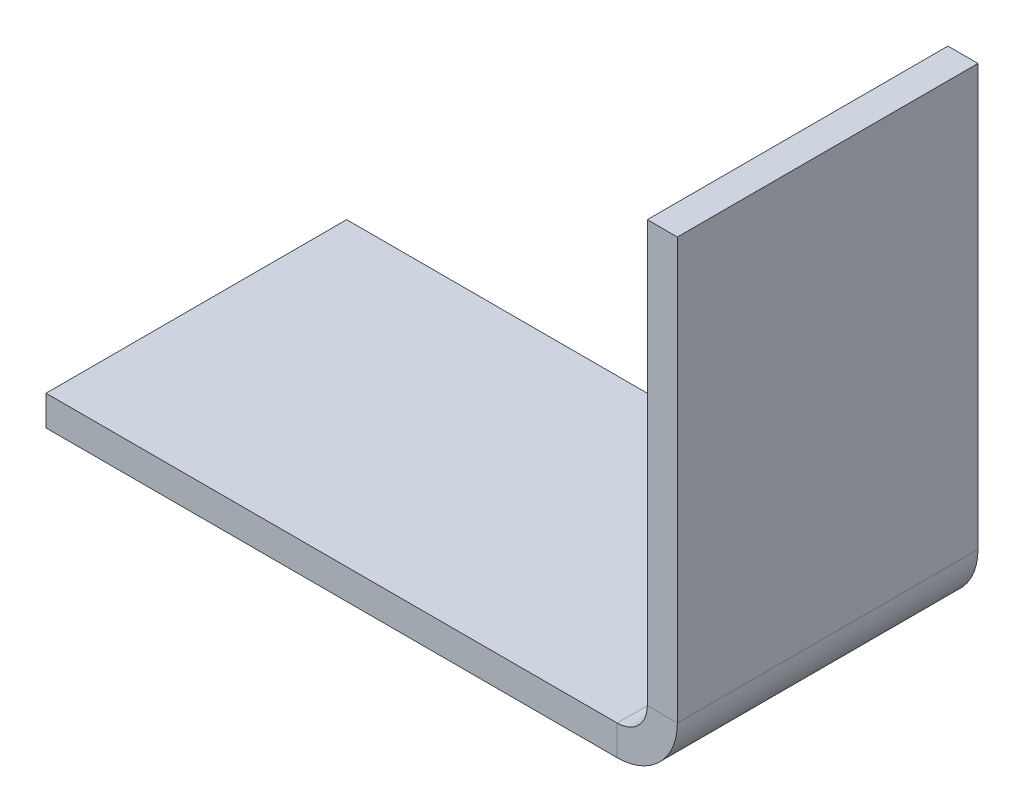
ISO-10303-21;
HEADER;
FILE_DESCRIPTION(('STEP AP214'),'2;1');
FILE_NAME('part.step','',(''),(''),'','','');
FILE_SCHEMA(('AUTOMOTIVE_DESIGN { 1 0 10303 214 1 1 1 1 }'));
ENDSEC;
DATA;
#1=APPLICATION_CONTEXT('core data for automotive mechanical design processes');
#2=APPLICATION_PROTOCOL_DEFINITION('international standard','automotive_design',2000,#1);
#3=PRODUCT_CONTEXT('',#1,'mechanical');
#4=PRODUCT('Part','Part','',(#3));
#5=PRODUCT_RELATED_PRODUCT_CATEGORY('part','',(#4));
#6=PRODUCT_DEFINITION_FORMATION('','',#4);
#7=PRODUCT_DEFINITION_CONTEXT('part definition',#1,'design');
#8=PRODUCT_DEFINITION('design','',#6,#7);
#9=PRODUCT_DEFINITION_SHAPE('','',#8);
#10=(LENGTH_UNIT() NAMED_UNIT(*) SI_UNIT(.MILLI.,.METRE.));
#11=(NAMED_UNIT(*) PLANE_ANGLE_UNIT() SI_UNIT($,.RADIAN.));
#12=(NAMED_UNIT(*) SI_UNIT($,.STERADIAN.) SOLID_ANGLE_UNIT());
#13=UNCERTAINTY_MEASURE_WITH_UNIT(LENGTH_MEASURE(1.E-05),#10,'distance_accuracy_value','');
#14=(GEOMETRIC_REPRESENTATION_CONTEXT(3) GLOBAL_UNCERTAINTY_ASSIGNED_CONTEXT((#13)) GLOBAL_UNIT_ASSIGNED_CONTEXT((#10,
#11,#12)) REPRESENTATION_CONTEXT('',''));
#15=CARTESIAN_POINT('',(0.,0.,0.));
#16=DIRECTION('',(0.,0.,1.));
#17=DIRECTION('',(1.,0.,0.));
#18=AXIS2_PLACEMENT_3D('',#15,#16,#17);
#19=CARTESIAN_POINT('',(20.,1.,10.));
#20=DIRECTION('',(0.,0.,1.));
#21=DIRECTION('',(1.,0.,0.));
#22=AXIS2_PLACEMENT_3D('',#19,#20,#21);
#23=PLANE('',#22);
#24=DIRECTION('',(1.,0.,0.));
#25=VECTOR('',#24,1.);
#26=CARTESIAN_POINT('',(20.,1.,10.));
#27=LINE('',#26,#25);
#28=CARTESIAN_POINT('',(20.,1.,10.));
#29=VERTEX_POINT('',#28);
#30=CARTESIAN_POINT('',(21.,1.,10.));
#31=VERTEX_POINT('',#30);
#32=EDGE_CURVE('E11',#29,#31,#27,.T.);
#33=ORIENTED_EDGE('',*,*,#32,.F.);
#34=CARTESIAN_POINT('',(19.,1.,10.));
#35=DIRECTION('',(0.,0.,-1.));
#36=DIRECTION('',(-1.,0.,0.));
#37=AXIS2_PLACEMENT_3D('',#34,#35,#36);
#38=CIRCLE('',#37,1.);
#39=CARTESIAN_POINT('',(19.,0.,10.));
#40=VERTEX_POINT('',#39);
#41=EDGE_CURVE('E136',#40,#29,#38,.F.);
#42=ORIENTED_EDGE('',*,*,#41,.F.);
#43=DIRECTION('',(0.,1.,0.));
#44=VECTOR('',#43,1.);
#45=CARTESIAN_POINT('',(19.,-1.,10.));
#46=LINE('',#45,#44);
#47=CARTESIAN_POINT('',(19.,-1.,10.));
#48=VERTEX_POINT('',#47);
#49=EDGE_CURVE('E47',#48,#40,#46,.T.);
#50=ORIENTED_EDGE('',*,*,#49,.F.);
#51=CARTESIAN_POINT('',(19.,1.,10.));
#52=DIRECTION('',(0.,0.,1.));
#53=DIRECTION('',(1.,0.,0.));
#54=AXIS2_PLACEMENT_3D('',#51,#52,#53);
#55=CIRCLE('',#54,2.);
#56=EDGE_CURVE('E133',#48,#31,#55,.T.);
#57=ORIENTED_EDGE('',*,*,#56,.T.);
#58=EDGE_LOOP('',(#33,#42,#50,#57));
#59=FACE_BOUND('',#58,.T.);
#60=ADVANCED_FACE('F41',(#59),#23,.T.);
#61=CARTESIAN_POINT('',(19.,-1.,10.));
#62=DIRECTION('',(0.,0.,1.));
#63=DIRECTION('',(1.,0.,0.));
#64=AXIS2_PLACEMENT_3D('',#61,#62,#63);
#65=PLANE('',#64);
#66=DIRECTION('',(0.,1.,0.));
#67=VECTOR('',#66,1.);
#68=CARTESIAN_POINT('',(20.,0.,10.));
#69=LINE('',#68,#67);
#70=CARTESIAN_POINT('',(20.,15.,10.));
#71=VERTEX_POINT('',#70);
#72=EDGE_CURVE('E189',#29,#71,#69,.T.);
#73=ORIENTED_EDGE('',*,*,#72,.F.);
#74=ORIENTED_EDGE('',*,*,#32,.T.);
#75=DIRECTION('',(0.,1.,0.));
#76=VECTOR('',#75,1.);
#77=CARTESIAN_POINT('',(21.,0.,10.));
#78=LINE('',#77,#76);
#79=CARTESIAN_POINT('',(21.,15.,10.));
#80=VERTEX_POINT('',#79);
#81=EDGE_CURVE('E100',#31,#80,#78,.T.);
#82=ORIENTED_EDGE('',*,*,#81,.T.);
#83=DIRECTION('',(1.,0.,0.));
#84=VECTOR('',#83,1.);
#85=CARTESIAN_POINT('',(20.,15.,10.));
#86=LINE('',#85,#84);
#87=EDGE_CURVE('E344',#71,#80,#86,.T.);
#88=ORIENTED_EDGE('',*,*,#87,.F.);
#89=EDGE_LOOP('',(#73,#74,#82,#88));
#90=FACE_BOUND('',#89,.T.);
#91=ADVANCED_FACE('F192',(#90),#65,.T.);
#92=CARTESIAN_POINT('',(19.,0.,0.));
#93=DIRECTION('',(0.,0.,-1.));
#94=DIRECTION('',(-1.,0.,0.));
#95=AXIS2_PLACEMENT_3D('',#92,#93,#94);
#96=PLANE('',#95);
#97=DIRECTION('',(0.,-1.,0.));
#98=VECTOR('',#97,1.);
#99=CARTESIAN_POINT('',(19.,0.,0.));
#100=LINE('',#99,#98);
#101=CARTESIAN_POINT('',(19.,0.,0.));
#102=VERTEX_POINT('',#101);
#103=CARTESIAN_POINT('',(19.,-1.,0.));
#104=VERTEX_POINT('',#103);
#105=EDGE_CURVE('E84',#102,#104,#100,.T.);
#106=ORIENTED_EDGE('',*,*,#105,.F.);
#107=CARTESIAN_POINT('',(19.,1.,0.));
#108=DIRECTION('',(0.,0.,-1.));
#109=DIRECTION('',(-1.,0.,0.));
#110=AXIS2_PLACEMENT_3D('',#107,#108,#109);
#111=CIRCLE('',#110,1.);
#112=CARTESIAN_POINT('',(20.,1.,0.));
#113=VERTEX_POINT('',#112);
#114=EDGE_CURVE('E153',#102,#113,#111,.F.);
#115=ORIENTED_EDGE('',*,*,#114,.T.);
#116=DIRECTION('',(-1.,0.,0.));
#117=VECTOR('',#116,1.);
#118=CARTESIAN_POINT('',(21.,1.,0.));
#119=LINE('',#118,#117);
#120=CARTESIAN_POINT('',(21.,1.,0.));
#121=VERTEX_POINT('',#120);
#122=EDGE_CURVE('E93',#121,#113,#119,.T.);
#123=ORIENTED_EDGE('',*,*,#122,.F.);
#124=CARTESIAN_POINT('',(19.,1.,0.));
#125=DIRECTION('',(0.,0.,1.));
#126=DIRECTION('',(1.,0.,0.));
#127=AXIS2_PLACEMENT_3D('',#124,#125,#126);
#128=CIRCLE('',#127,2.);
#129=EDGE_CURVE('E159',#104,#121,#128,.T.);
#130=ORIENTED_EDGE('',*,*,#129,.F.);
#131=EDGE_LOOP('',(#106,#115,#123,#130));
#132=FACE_BOUND('',#131,.T.);
#133=ADVANCED_FACE('F191',(#132),#96,.T.);
#134=CARTESIAN_POINT('',(21.,1.,0.));
#135=DIRECTION('',(0.,0.,-1.));
#136=DIRECTION('',(-1.,0.,0.));
#137=AXIS2_PLACEMENT_3D('',#134,#135,#136);
#138=PLANE('',#137);
#139=DIRECTION('',(1.,0.,0.));
#140=VECTOR('',#139,1.);
#141=CARTESIAN_POINT('',(0.,0.,0.));
#142=LINE('',#141,#140);
#143=CARTESIAN_POINT('',(0.,0.,0.));
#144=VERTEX_POINT('',#143);
#145=EDGE_CURVE('E154',#144,#102,#142,.T.);
#146=ORIENTED_EDGE('',*,*,#145,.T.);
#147=ORIENTED_EDGE('',*,*,#105,.T.);
#148=DIRECTION('',(1.,0.,0.));
#149=VECTOR('',#148,1.);
#150=CARTESIAN_POINT('',(0.,-1.,0.));
#151=LINE('',#150,#149);
#152=CARTESIAN_POINT('',(0.,-1.,0.));
#153=VERTEX_POINT('',#152);
#154=EDGE_CURVE('E158',#153,#104,#151,.T.);
#155=ORIENTED_EDGE('',*,*,#154,.F.);
#156=DIRECTION('',(0.,1.,0.));
#157=VECTOR('',#156,1.);
#158=CARTESIAN_POINT('',(0.,-1.,0.));
#159=LINE('',#158,#157);
#160=EDGE_CURVE('E120',#153,#144,#159,.T.);
#161=ORIENTED_EDGE('',*,*,#160,.T.);
#162=EDGE_LOOP('',(#146,#147,#155,#161));
#163=FACE_BOUND('',#162,.T.);
#164=ADVANCED_FACE('F190',(#163),#138,.T.);
#165=CARTESIAN_POINT('',(21.,0.,10.));
#166=DIRECTION('',(-1.,0.,0.));
#167=DIRECTION('',(0.,0.,1.));
#168=AXIS2_PLACEMENT_3D('',#165,#166,#167);
#169=PLANE('',#168);
#170=DIRECTION('',(0.,1.,0.));
#171=VECTOR('',#170,1.);
#172=CARTESIAN_POINT('',(21.,0.,0.));
#173=LINE('',#172,#171);
#174=CARTESIAN_POINT('',(21.,15.,0.));
#175=VERTEX_POINT('',#174);
#176=EDGE_CURVE('E145',#121,#175,#173,.T.);
#177=ORIENTED_EDGE('',*,*,#176,.T.);
#178=DIRECTION('',(0.,0.,-1.));
#179=VECTOR('',#178,1.);
#180=CARTESIAN_POINT('',(21.,15.,10.));
#181=LINE('',#180,#179);
#182=EDGE_CURVE('E175',#80,#175,#181,.T.);
#183=ORIENTED_EDGE('',*,*,#182,.F.);
#184=ORIENTED_EDGE('',*,*,#81,.F.);
#185=DIRECTION('',(0.,0.,-1.));
#186=VECTOR('',#185,1.);
#187=CARTESIAN_POINT('',(21.,1.,10.));
#188=LINE('',#187,#186);
#189=EDGE_CURVE('E141',#31,#121,#188,.T.);
#190=ORIENTED_EDGE('',*,*,#189,.T.);
#191=EDGE_LOOP('',(#177,#183,#184,#190));
#192=FACE_BOUND('',#191,.T.);
#193=ADVANCED_FACE('F203',(#192),#169,.F.);
#194=CARTESIAN_POINT('',(20.,15.,10.));
#195=DIRECTION('',(0.,1.,0.));
#196=DIRECTION('',(0.,0.,1.));
#197=AXIS2_PLACEMENT_3D('',#194,#195,#196);
#198=PLANE('',#197);
#199=DIRECTION('',(1.,0.,0.));
#200=VECTOR('',#199,1.);
#201=CARTESIAN_POINT('',(20.,15.,0.));
#202=LINE('',#201,#200);
#203=CARTESIAN_POINT('',(20.,15.,0.));
#204=VERTEX_POINT('',#203);
#205=EDGE_CURVE('E150',#204,#175,#202,.T.);
#206=ORIENTED_EDGE('',*,*,#205,.F.);
#207=DIRECTION('',(0.,0.,-1.));
#208=VECTOR('',#207,1.);
#209=CARTESIAN_POINT('',(20.,15.,10.));
#210=LINE('',#209,#208);
#211=EDGE_CURVE('E174',#71,#204,#210,.T.);
#212=ORIENTED_EDGE('',*,*,#211,.F.);
#213=ORIENTED_EDGE('',*,*,#87,.T.);
#214=ORIENTED_EDGE('',*,*,#182,.T.);
#215=EDGE_LOOP('',(#206,#212,#213,#214));
#216=FACE_BOUND('',#215,.T.);
#217=ADVANCED_FACE('F234',(#216),#198,.T.);
#218=CARTESIAN_POINT('',(20.,0.,10.));
#219=DIRECTION('',(-1.,0.,0.));
#220=DIRECTION('',(0.,0.,1.));
#221=AXIS2_PLACEMENT_3D('',#218,#219,#220);
#222=PLANE('',#221);
#223=DIRECTION('',(0.,1.,0.));
#224=VECTOR('',#223,1.);
#225=CARTESIAN_POINT('',(20.,0.,0.));
#226=LINE('',#225,#224);
#227=EDGE_CURVE('E147',#113,#204,#226,.T.);
#228=ORIENTED_EDGE('',*,*,#227,.F.);
#229=DIRECTION('',(0.,0.,-1.));
#230=VECTOR('',#229,1.);
#231=CARTESIAN_POINT('',(20.,1.,10.));
#232=LINE('',#231,#230);
#233=EDGE_CURVE('E166',#29,#113,#232,.T.);
#234=ORIENTED_EDGE('',*,*,#233,.F.);
#235=ORIENTED_EDGE('',*,*,#72,.T.);
#236=ORIENTED_EDGE('',*,*,#211,.T.);
#237=EDGE_LOOP('',(#228,#234,#235,#236));
#238=FACE_BOUND('',#237,.T.);
#239=ADVANCED_FACE('F241',(#238),#222,.T.);
#240=CARTESIAN_POINT('',(19.,1.,10.));
#241=DIRECTION('',(0.,0.,-1.));
#242=DIRECTION('',(-1.,0.,0.));
#243=AXIS2_PLACEMENT_3D('',#240,#241,#242);
#244=CYLINDRICAL_SURFACE('',#243,1.);
#245=ORIENTED_EDGE('',*,*,#114,.F.);
#246=DIRECTION('',(0.,0.,-1.));
#247=VECTOR('',#246,1.);
#248=CARTESIAN_POINT('',(19.,0.,10.));
#249=LINE('',#248,#247);
#250=EDGE_CURVE('E167',#40,#102,#249,.T.);
#251=ORIENTED_EDGE('',*,*,#250,.F.);
#252=ORIENTED_EDGE('',*,*,#41,.T.);
#253=ORIENTED_EDGE('',*,*,#233,.T.);
#254=EDGE_LOOP('',(#245,#251,#252,#253));
#255=FACE_BOUND('',#254,.T.);
#256=ADVANCED_FACE('F181',(#255),#244,.F.);
#257=CARTESIAN_POINT('',(0.,0.,10.));
#258=DIRECTION('',(0.,1.,0.));
#259=DIRECTION('',(0.,0.,1.));
#260=AXIS2_PLACEMENT_3D('',#257,#258,#259);
#261=PLANE('',#260);
#262=ORIENTED_EDGE('',*,*,#145,.F.);
#263=DIRECTION('',(0.,0.,-1.));
#264=VECTOR('',#263,1.);
#265=CARTESIAN_POINT('',(0.,0.,10.));
#266=LINE('',#265,#264);
#267=CARTESIAN_POINT('',(0.,0.,10.));
#268=VERTEX_POINT('',#267);
#269=EDGE_CURVE('E123',#268,#144,#266,.T.);
#270=ORIENTED_EDGE('',*,*,#269,.F.);
#271=DIRECTION('',(1.,0.,0.));
#272=VECTOR('',#271,1.);
#273=CARTESIAN_POINT('',(0.,0.,10.));
#274=LINE('',#273,#272);
#275=EDGE_CURVE('E138',#268,#40,#274,.T.);
#276=ORIENTED_EDGE('',*,*,#275,.T.);
#277=ORIENTED_EDGE('',*,*,#250,.T.);
#278=EDGE_LOOP('',(#262,#270,#276,#277));
#279=FACE_BOUND('',#278,.T.);
#280=ADVANCED_FACE('F187',(#279),#261,.T.);
#281=CARTESIAN_POINT('',(0.,-1.,10.));
#282=DIRECTION('',(-1.,0.,0.));
#283=DIRECTION('',(0.,0.,1.));
#284=AXIS2_PLACEMENT_3D('',#281,#282,#283);
#285=PLANE('',#284);
#286=ORIENTED_EDGE('',*,*,#160,.F.);
#287=DIRECTION('',(0.,0.,-1.));
#288=VECTOR('',#287,1.);
#289=CARTESIAN_POINT('',(0.,-1.,10.));
#290=LINE('',#289,#288);
#291=CARTESIAN_POINT('',(0.,-1.,10.));
#292=VERTEX_POINT('',#291);
#293=EDGE_CURVE('E114',#292,#153,#290,.T.);
#294=ORIENTED_EDGE('',*,*,#293,.F.);
#295=DIRECTION('',(0.,1.,0.));
#296=VECTOR('',#295,1.);
#297=CARTESIAN_POINT('',(0.,-1.,10.));
#298=LINE('',#297,#296);
#299=EDGE_CURVE('E119',#292,#268,#298,.T.);
#300=ORIENTED_EDGE('',*,*,#299,.T.);
#301=ORIENTED_EDGE('',*,*,#269,.T.);
#302=EDGE_LOOP('',(#286,#294,#300,#301));
#303=FACE_BOUND('',#302,.T.);
#304=ADVANCED_FACE('F113',(#303),#285,.T.);
#305=CARTESIAN_POINT('',(0.,-1.,10.));
#306=DIRECTION('',(0.,1.,0.));
#307=DIRECTION('',(0.,0.,1.));
#308=AXIS2_PLACEMENT_3D('',#305,#306,#307);
#309=PLANE('',#308);
#310=ORIENTED_EDGE('',*,*,#154,.T.);
#311=DIRECTION('',(0.,0.,-1.));
#312=VECTOR('',#311,1.);
#313=CARTESIAN_POINT('',(19.,-1.,10.));
#314=LINE('',#313,#312);
#315=EDGE_CURVE('E125',#48,#104,#314,.T.);
#316=ORIENTED_EDGE('',*,*,#315,.F.);
#317=DIRECTION('',(1.,0.,0.));
#318=VECTOR('',#317,1.);
#319=CARTESIAN_POINT('',(0.,-1.,10.));
#320=LINE('',#319,#318);
#321=EDGE_CURVE('E127',#292,#48,#320,.T.);
#322=ORIENTED_EDGE('',*,*,#321,.F.);
#323=ORIENTED_EDGE('',*,*,#293,.T.);
#324=EDGE_LOOP('',(#310,#316,#322,#323));
#325=FACE_BOUND('',#324,.T.);
#326=ADVANCED_FACE('F130',(#325),#309,.F.);
#327=CARTESIAN_POINT('',(19.,1.,10.));
#328=DIRECTION('',(0.,0.,-1.));
#329=DIRECTION('',(-1.,0.,0.));
#330=AXIS2_PLACEMENT_3D('',#327,#328,#329);
#331=CYLINDRICAL_SURFACE('',#330,2.);
#332=ORIENTED_EDGE('',*,*,#129,.T.);
#333=ORIENTED_EDGE('',*,*,#189,.F.);
#334=ORIENTED_EDGE('',*,*,#56,.F.);
#335=ORIENTED_EDGE('',*,*,#315,.T.);
#336=EDGE_LOOP('',(#332,#333,#334,#335));
#337=FACE_BOUND('',#336,.T.);
#338=ADVANCED_FACE('F193',(#337),#331,.T.);
#339=CARTESIAN_POINT('',(19.,1.,10.));
#340=DIRECTION('',(0.,0.,-1.));
#341=DIRECTION('',(-1.,0.,0.));
#342=AXIS2_PLACEMENT_3D('',#339,#340,#341);
#343=PLANE('',#342);
#344=ORIENTED_EDGE('',*,*,#321,.T.);
#345=ORIENTED_EDGE('',*,*,#49,.T.);
#346=ORIENTED_EDGE('',*,*,#275,.F.);
#347=ORIENTED_EDGE('',*,*,#299,.F.);
#348=EDGE_LOOP('',(#344,#345,#346,#347));
#349=FACE_BOUND('',#348,.T.);
#350=ADVANCED_FACE('F135',(#349),#343,.F.);
#351=CARTESIAN_POINT('',(19.,1.,0.));
#352=DIRECTION('',(0.,0.,-1.));
#353=DIRECTION('',(-1.,0.,0.));
#354=AXIS2_PLACEMENT_3D('',#351,#352,#353);
#355=PLANE('',#354);
#356=ORIENTED_EDGE('',*,*,#176,.F.);
#357=ORIENTED_EDGE('',*,*,#122,.T.);
#358=ORIENTED_EDGE('',*,*,#227,.T.);
#359=ORIENTED_EDGE('',*,*,#205,.T.);
#360=EDGE_LOOP('',(#356,#357,#358,#359));
#361=FACE_BOUND('',#360,.T.);
#362=ADVANCED_FACE('F313',(#361),#355,.T.);
#363=CLOSED_SHELL('',(#60,#91,#133,#164,#193,#217,#239,#256,#280,#304,#326,#338,#350,#362));
#364=MANIFOLD_SOLID_BREP('B2',#363);
#365=ADVANCED_BREP_SHAPE_REPRESENTATION('',(#18,#364),#14);
#366=SHAPE_DEFINITION_REPRESENTATION(#9,#365);
ENDSEC;
END-ISO-10303-21;
